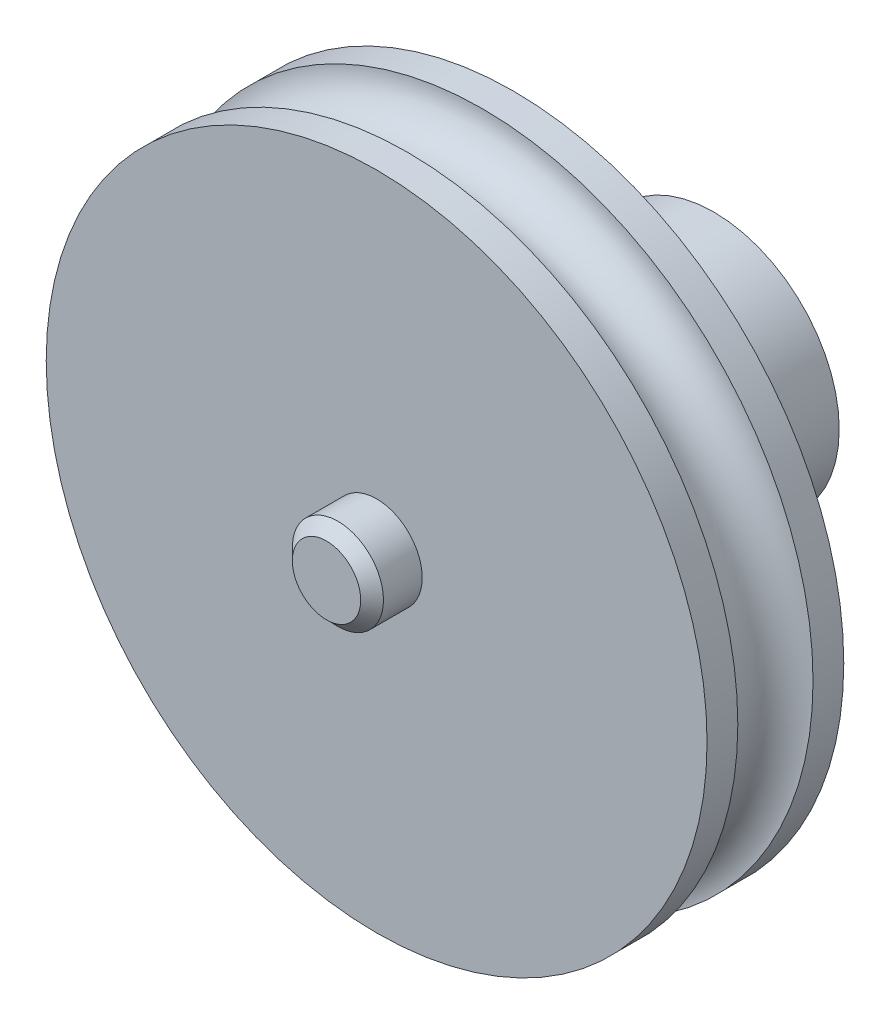
ISO-10303-21;
HEADER;
FILE_DESCRIPTION(('STEP AP214'),'2;1');
FILE_NAME('part.step','',(''),(''),'','','');
FILE_SCHEMA(('AUTOMOTIVE_DESIGN { 1 0 10303 214 1 1 1 1 }'));
ENDSEC;
DATA;
#1=APPLICATION_CONTEXT('core data for automotive mechanical design processes');
#2=APPLICATION_PROTOCOL_DEFINITION('international standard','automotive_design',2000,#1);
#3=PRODUCT_CONTEXT('',#1,'mechanical');
#4=PRODUCT('Part','Part','',(#3));
#5=PRODUCT_RELATED_PRODUCT_CATEGORY('part','',(#4));
#6=PRODUCT_DEFINITION_FORMATION('','',#4);
#7=PRODUCT_DEFINITION_CONTEXT('part definition',#1,'design');
#8=PRODUCT_DEFINITION('design','',#6,#7);
#9=PRODUCT_DEFINITION_SHAPE('','',#8);
#10=(LENGTH_UNIT() NAMED_UNIT(*) SI_UNIT(.MILLI.,.METRE.));
#11=(NAMED_UNIT(*) PLANE_ANGLE_UNIT() SI_UNIT($,.RADIAN.));
#12=(NAMED_UNIT(*) SI_UNIT($,.STERADIAN.) SOLID_ANGLE_UNIT());
#13=UNCERTAINTY_MEASURE_WITH_UNIT(LENGTH_MEASURE(1.E-05),#10,'distance_accuracy_value','');
#14=(GEOMETRIC_REPRESENTATION_CONTEXT(3) GLOBAL_UNCERTAINTY_ASSIGNED_CONTEXT((#13)) GLOBAL_UNIT_ASSIGNED_CONTEXT((#10,
#11,#12)) REPRESENTATION_CONTEXT('',''));
#15=CARTESIAN_POINT('',(0.,0.,0.));
#16=DIRECTION('',(0.,0.,1.));
#17=DIRECTION('',(1.,0.,0.));
#18=AXIS2_PLACEMENT_3D('',#15,#16,#17);
#19=CARTESIAN_POINT('',(0.,0.,-3.));
#20=DIRECTION('',(0.,0.,1.));
#21=DIRECTION('',(1.,0.,0.));
#22=AXIS2_PLACEMENT_3D('',#19,#20,#21);
#23=PLANE('',#22);
#24=CARTESIAN_POINT('',(0.,0.,-3.));
#25=DIRECTION('',(0.,0.,1.));
#26=DIRECTION('',(1.,0.,0.));
#27=AXIS2_PLACEMENT_3D('',#24,#25,#26);
#28=CIRCLE('',#27,14.5);
#29=CARTESIAN_POINT('',(14.5,0.,-3.));
#30=VERTEX_POINT('',#29);
#31=EDGE_CURVE('E45',#30,#30,#28,.T.);
#32=ORIENTED_EDGE('',*,*,#31,.F.);
#33=EDGE_LOOP('',(#32));
#34=FACE_BOUND('',#33,.T.);
#35=CARTESIAN_POINT('',(0.,0.,-3.));
#36=DIRECTION('',(0.,0.,1.));
#37=DIRECTION('',(1.,0.,0.));
#38=AXIS2_PLACEMENT_3D('',#35,#36,#37);
#39=CIRCLE('',#38,5.5);
#40=CARTESIAN_POINT('',(5.5,0.,-3.));
#41=VERTEX_POINT('',#40);
#42=EDGE_CURVE('E10',#41,#41,#39,.F.);
#43=ORIENTED_EDGE('',*,*,#42,.F.);
#44=EDGE_LOOP('',(#43));
#45=FACE_BOUND('',#44,.T.);
#46=ADVANCED_FACE('F30',(#34,#45),#23,.F.);
#47=CARTESIAN_POINT('',(0.,0.,3.));
#48=DIRECTION('',(0.,0.,1.));
#49=DIRECTION('',(1.,0.,0.));
#50=AXIS2_PLACEMENT_3D('',#47,#48,#49);
#51=PLANE('',#50);
#52=CARTESIAN_POINT('',(0.,0.,3.));
#53=DIRECTION('',(0.,0.,1.));
#54=DIRECTION('',(1.,0.,0.));
#55=AXIS2_PLACEMENT_3D('',#52,#53,#54);
#56=CIRCLE('',#55,14.5);
#57=CARTESIAN_POINT('',(14.5,0.,3.));
#58=VERTEX_POINT('',#57);
#59=EDGE_CURVE('E51',#58,#58,#56,.T.);
#60=ORIENTED_EDGE('',*,*,#59,.T.);
#61=EDGE_LOOP('',(#60));
#62=FACE_BOUND('',#61,.T.);
#63=CARTESIAN_POINT('',(0.,0.,3.));
#64=DIRECTION('',(0.,0.,1.));
#65=DIRECTION('',(1.,0.,0.));
#66=AXIS2_PLACEMENT_3D('',#63,#64,#65);
#67=CIRCLE('',#66,2.);
#68=CARTESIAN_POINT('',(2.,0.,3.));
#69=VERTEX_POINT('',#68);
#70=EDGE_CURVE('E55',#69,#69,#67,.T.);
#71=ORIENTED_EDGE('',*,*,#70,.F.);
#72=EDGE_LOOP('',(#71));
#73=FACE_BOUND('',#72,.T.);
#74=ADVANCED_FACE('F80',(#62,#73),#51,.T.);
#75=CARTESIAN_POINT('',(0.,0.,-3.));
#76=DIRECTION('',(0.,0.,1.));
#77=DIRECTION('',(1.,0.,0.));
#78=AXIS2_PLACEMENT_3D('',#75,#76,#77);
#79=CYLINDRICAL_SURFACE('',#78,14.5);
#80=CARTESIAN_POINT('',(0.,0.,-1.65));
#81=DIRECTION('',(0.,0.,1.));
#82=DIRECTION('',(1.,0.,0.));
#83=AXIS2_PLACEMENT_3D('',#80,#81,#82);
#84=CIRCLE('',#83,14.5);
#85=CARTESIAN_POINT('',(14.5,0.,-1.65));
#86=VERTEX_POINT('',#85);
#87=EDGE_CURVE('E48',#86,#86,#84,.T.);
#88=ORIENTED_EDGE('',*,*,#87,.F.);
#89=EDGE_LOOP('',(#88));
#90=FACE_BOUND('',#89,.T.);
#91=ORIENTED_EDGE('',*,*,#31,.T.);
#92=EDGE_LOOP('',(#91));
#93=FACE_BOUND('',#92,.T.);
#94=ADVANCED_FACE('F86',(#90,#93),#79,.T.);
#95=CARTESIAN_POINT('',(0.,0.,0.));
#96=DIRECTION('',(0.,0.,-1.));
#97=DIRECTION('',(-1.,0.,0.));
#98=AXIS2_PLACEMENT_3D('',#95,#96,#97);
#99=TOROIDAL_SURFACE('',#98,14.5,1.65);
#100=ORIENTED_EDGE('',*,*,#87,.T.);
#101=EDGE_LOOP('',(#100));
#102=FACE_BOUND('',#101,.T.);
#103=CARTESIAN_POINT('',(0.,0.,1.65));
#104=DIRECTION('',(0.,0.,-1.));
#105=DIRECTION('',(-1.,0.,0.));
#106=AXIS2_PLACEMENT_3D('',#103,#104,#105);
#107=CIRCLE('',#106,14.5);
#108=CARTESIAN_POINT('',(-14.5,0.,1.65));
#109=VERTEX_POINT('',#108);
#110=EDGE_CURVE('E52',#109,#109,#107,.T.);
#111=ORIENTED_EDGE('',*,*,#110,.T.);
#112=EDGE_LOOP('',(#111));
#113=FACE_BOUND('',#112,.T.);
#114=ADVANCED_FACE('F95',(#102,#113),#99,.F.);
#115=ORIENTED_EDGE('',*,*,#110,.F.);
#116=EDGE_LOOP('',(#115));
#117=FACE_BOUND('',#116,.T.);
#118=ORIENTED_EDGE('',*,*,#59,.F.);
#119=EDGE_LOOP('',(#118));
#120=FACE_BOUND('',#119,.T.);
#121=ADVANCED_FACE('F92',(#117,#120),#79,.T.);
#122=CARTESIAN_POINT('',(0.,0.,5.2));
#123=DIRECTION('',(0.,0.,-1.));
#124=DIRECTION('',(-1.,0.,0.));
#125=AXIS2_PLACEMENT_3D('',#122,#123,#124);
#126=CYLINDRICAL_SURFACE('',#125,2.);
#127=CARTESIAN_POINT('',(0.,0.,4.69999999999999));
#128=DIRECTION('',(0.,0.,1.));
#129=DIRECTION('',(1.,0.,0.));
#130=AXIS2_PLACEMENT_3D('',#127,#128,#129);
#131=CIRCLE('',#130,2.);
#132=CARTESIAN_POINT('',(2.,0.,4.69999999999999));
#133=VERTEX_POINT('',#132);
#134=EDGE_CURVE('E37',#133,#133,#131,.F.);
#135=ORIENTED_EDGE('',*,*,#134,.T.);
#136=EDGE_LOOP('',(#135));
#137=FACE_BOUND('',#136,.T.);
#138=ORIENTED_EDGE('',*,*,#70,.T.);
#139=EDGE_LOOP('',(#138));
#140=FACE_BOUND('',#139,.T.);
#141=ADVANCED_FACE('F94',(#137,#140),#126,.T.);
#142=CARTESIAN_POINT('',(0.,0.,5.2));
#143=DIRECTION('',(0.,0.,1.));
#144=DIRECTION('',(1.,0.,0.));
#145=AXIS2_PLACEMENT_3D('',#142,#143,#144);
#146=PLANE('',#145);
#147=CARTESIAN_POINT('',(0.,0.,5.2));
#148=DIRECTION('',(0.,0.,1.));
#149=DIRECTION('',(1.,0.,0.));
#150=AXIS2_PLACEMENT_3D('',#147,#148,#149);
#151=CIRCLE('',#150,1.5);
#152=CARTESIAN_POINT('',(1.5,0.,5.2));
#153=VERTEX_POINT('',#152);
#154=EDGE_CURVE('E41',#153,#153,#151,.T.);
#155=ORIENTED_EDGE('',*,*,#154,.T.);
#156=EDGE_LOOP('',(#155));
#157=FACE_BOUND('',#156,.T.);
#158=ADVANCED_FACE('F76',(#157),#146,.T.);
#159=CARTESIAN_POINT('',(0.,0.,5.2));
#160=DIRECTION('',(0.,0.,-1.));
#161=DIRECTION('',(-1.,0.,0.));
#162=AXIS2_PLACEMENT_3D('',#159,#160,#161);
#163=CONICAL_SURFACE('',#162,1.5,0.785398163397441);
#164=ORIENTED_EDGE('',*,*,#134,.F.);
#165=EDGE_LOOP('',(#164));
#166=FACE_BOUND('',#165,.T.);
#167=ORIENTED_EDGE('',*,*,#154,.F.);
#168=EDGE_LOOP('',(#167));
#169=FACE_BOUND('',#168,.T.);
#170=ADVANCED_FACE('F32',(#166,#169),#163,.T.);
#171=CARTESIAN_POINT('',(0.,0.,-11.8));
#172=DIRECTION('',(0.,0.,1.));
#173=DIRECTION('',(1.,0.,0.));
#174=AXIS2_PLACEMENT_3D('',#171,#172,#173);
#175=CYLINDRICAL_SURFACE('',#174,5.5);
#176=CARTESIAN_POINT('',(0.,0.,-11.8));
#177=DIRECTION('',(0.,0.,-1.));
#178=DIRECTION('',(-1.,0.,0.));
#179=AXIS2_PLACEMENT_3D('',#176,#177,#178);
#180=CIRCLE('',#179,5.5);
#181=CARTESIAN_POINT('',(-5.5,0.,-11.8));
#182=VERTEX_POINT('',#181);
#183=EDGE_CURVE('E62',#182,#182,#180,.T.);
#184=ORIENTED_EDGE('',*,*,#183,.F.);
#185=EDGE_LOOP('',(#184));
#186=FACE_BOUND('',#185,.T.);
#187=ORIENTED_EDGE('',*,*,#42,.T.);
#188=EDGE_LOOP('',(#187));
#189=FACE_BOUND('',#188,.T.);
#190=ADVANCED_FACE('F68',(#186,#189),#175,.T.);
#191=CARTESIAN_POINT('',(0.,0.,-11.8));
#192=DIRECTION('',(0.,0.,-1.));
#193=DIRECTION('',(-1.,0.,0.));
#194=AXIS2_PLACEMENT_3D('',#191,#192,#193);
#195=PLANE('',#194);
#196=ORIENTED_EDGE('',*,*,#183,.T.);
#197=EDGE_LOOP('',(#196));
#198=FACE_BOUND('',#197,.T.);
#199=ADVANCED_FACE('F66',(#198),#195,.T.);
#200=CLOSED_SHELL('',(#46,#74,#94,#114,#121,#141,#158,#170,#190,#199));
#201=MANIFOLD_SOLID_BREP('B2',#200);
#202=ADVANCED_BREP_SHAPE_REPRESENTATION('',(#18,#201),#14);
#203=SHAPE_DEFINITION_REPRESENTATION(#9,#202);
ENDSEC;
END-ISO-10303-21;
